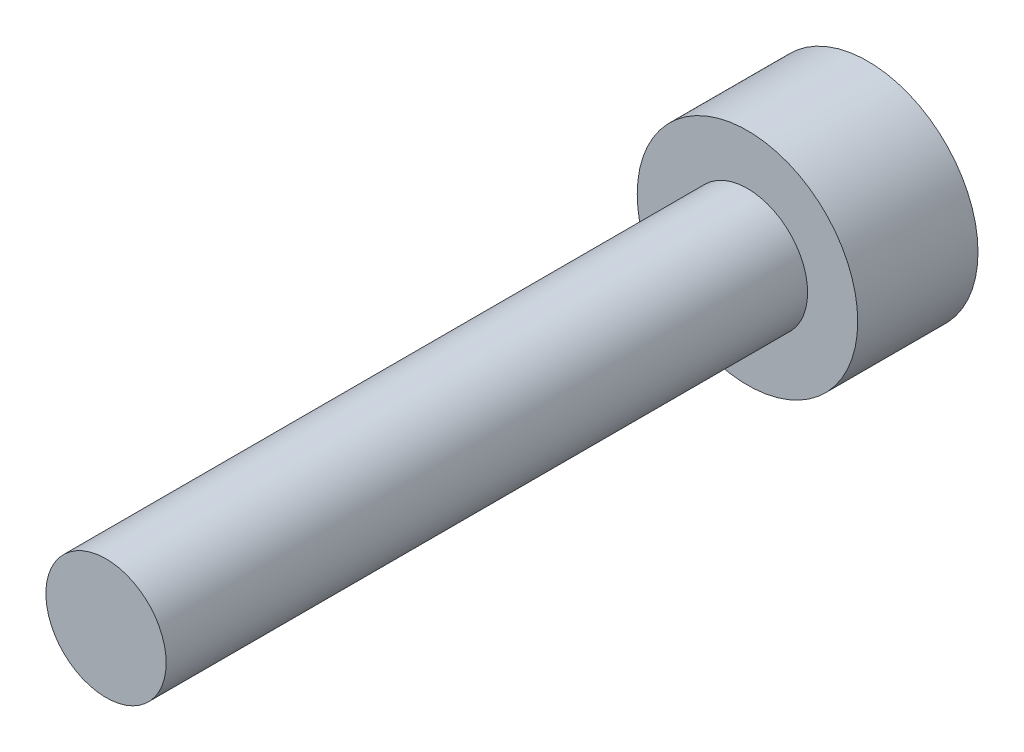
ISO-10303-21;
HEADER;
FILE_DESCRIPTION(('STEP AP214'),'2;1');
FILE_NAME('part.step','',(''),(''),'','','');
FILE_SCHEMA(('AUTOMOTIVE_DESIGN { 1 0 10303 214 1 1 1 1 }'));
ENDSEC;
DATA;
#1=APPLICATION_CONTEXT('core data for automotive mechanical design processes');
#2=APPLICATION_PROTOCOL_DEFINITION('international standard','automotive_design',2000,#1);
#3=PRODUCT_CONTEXT('',#1,'mechanical');
#4=PRODUCT('Part','Part','',(#3));
#5=PRODUCT_RELATED_PRODUCT_CATEGORY('part','',(#4));
#6=PRODUCT_DEFINITION_FORMATION('','',#4);
#7=PRODUCT_DEFINITION_CONTEXT('part definition',#1,'design');
#8=PRODUCT_DEFINITION('design','',#6,#7);
#9=PRODUCT_DEFINITION_SHAPE('','',#8);
#10=(LENGTH_UNIT() NAMED_UNIT(*) SI_UNIT(.MILLI.,.METRE.));
#11=(NAMED_UNIT(*) PLANE_ANGLE_UNIT() SI_UNIT($,.RADIAN.));
#12=(NAMED_UNIT(*) SI_UNIT($,.STERADIAN.) SOLID_ANGLE_UNIT());
#13=UNCERTAINTY_MEASURE_WITH_UNIT(LENGTH_MEASURE(1.E-05),#10,'distance_accuracy_value','');
#14=(GEOMETRIC_REPRESENTATION_CONTEXT(3) GLOBAL_UNCERTAINTY_ASSIGNED_CONTEXT((#13)) GLOBAL_UNIT_ASSIGNED_CONTEXT((#10,
#11,#12)) REPRESENTATION_CONTEXT('',''));
#15=CARTESIAN_POINT('',(0.,0.,0.));
#16=DIRECTION('',(0.,0.,1.));
#17=DIRECTION('',(1.,0.,0.));
#18=AXIS2_PLACEMENT_3D('',#15,#16,#17);
#19=CARTESIAN_POINT('',(0.,0.,-3.));
#20=DIRECTION('',(0.,0.,1.));
#21=DIRECTION('',(1.,0.,0.));
#22=AXIS2_PLACEMENT_3D('',#19,#20,#21);
#23=PLANE('',#22);
#24=CARTESIAN_POINT('',(0.,0.,-3.));
#25=DIRECTION('',(0.,0.,1.));
#26=DIRECTION('',(1.,0.,0.));
#27=AXIS2_PLACEMENT_3D('',#24,#25,#26);
#28=CIRCLE('',#27,2.75);
#29=CARTESIAN_POINT('',(2.75,0.,-3.));
#30=VERTEX_POINT('',#29);
#31=EDGE_CURVE('E50',#30,#30,#28,.T.);
#32=ORIENTED_EDGE('',*,*,#31,.F.);
#33=EDGE_LOOP('',(#32));
#34=FACE_BOUND('',#33,.T.);
#35=DIRECTION('',(0.866025403784441,-0.499999999999995,0.));
#36=VECTOR('',#35,1.);
#37=CARTESIAN_POINT('',(-1.24999999999999,-0.721687836487047,-3.));
#38=LINE('',#37,#36);
#39=CARTESIAN_POINT('',(-1.24999999999999,-0.721687836487047,-3.));
#40=VERTEX_POINT('',#39);
#41=CARTESIAN_POINT('',(0.,-1.44337567297406,-3.));
#42=VERTEX_POINT('',#41);
#43=EDGE_CURVE('E64',#40,#42,#38,.T.);
#44=ORIENTED_EDGE('',*,*,#43,.T.);
#45=DIRECTION('',(0.866025403784438,0.500000000000001,0.));
#46=VECTOR('',#45,1.);
#47=CARTESIAN_POINT('',(0.,-1.44337567297406,-3.));
#48=LINE('',#47,#46);
#49=CARTESIAN_POINT('',(1.25,-0.721687836487029,-3.));
#50=VERTEX_POINT('',#49);
#51=EDGE_CURVE('E140',#42,#50,#48,.T.);
#52=ORIENTED_EDGE('',*,*,#51,.T.);
#53=DIRECTION('',(0.,1.,0.));
#54=VECTOR('',#53,1.);
#55=CARTESIAN_POINT('',(1.25,-0.721687836487029,-3.));
#56=LINE('',#55,#54);
#57=CARTESIAN_POINT('',(1.25,0.721687836487038,-3.));
#58=VERTEX_POINT('',#57);
#59=EDGE_CURVE('E142',#50,#58,#56,.T.);
#60=ORIENTED_EDGE('',*,*,#59,.T.);
#61=DIRECTION('',(-0.866025403784442,0.499999999999995,0.));
#62=VECTOR('',#61,1.);
#63=CARTESIAN_POINT('',(1.25,0.721687836487038,-3.));
#64=LINE('',#63,#62);
#65=CARTESIAN_POINT('',(0.,1.44337567297406,-3.));
#66=VERTEX_POINT('',#65);
#67=EDGE_CURVE('E144',#58,#66,#64,.T.);
#68=ORIENTED_EDGE('',*,*,#67,.T.);
#69=DIRECTION('',(-0.866025403784434,-0.500000000000007,0.));
#70=VECTOR('',#69,1.);
#71=CARTESIAN_POINT('',(0.,1.44337567297406,-3.));
#72=LINE('',#71,#70);
#73=CARTESIAN_POINT('',(-1.25000000000001,0.721687836487021,-3.));
#74=VERTEX_POINT('',#73);
#75=EDGE_CURVE('E125',#66,#74,#72,.T.);
#76=ORIENTED_EDGE('',*,*,#75,.T.);
#77=DIRECTION('',(0.,-1.,0.));
#78=VECTOR('',#77,1.);
#79=CARTESIAN_POINT('',(-1.25000000000001,0.721687836487021,-3.));
#80=LINE('',#79,#78);
#81=EDGE_CURVE('E147',#74,#40,#80,.T.);
#82=ORIENTED_EDGE('',*,*,#81,.T.);
#83=EDGE_LOOP('',(#44,#52,#60,#68,#76,#82));
#84=FACE_BOUND('',#83,.T.);
#85=ADVANCED_FACE('F43',(#34,#84),#23,.F.);
#86=CARTESIAN_POINT('',(0.,0.,0.));
#87=DIRECTION('',(0.,0.,-1.));
#88=DIRECTION('',(-1.,0.,0.));
#89=AXIS2_PLACEMENT_3D('',#86,#87,#88);
#90=CYLINDRICAL_SURFACE('',#89,2.75);
#91=CARTESIAN_POINT('',(0.,0.,0.));
#92=DIRECTION('',(0.,0.,1.));
#93=DIRECTION('',(1.,0.,0.));
#94=AXIS2_PLACEMENT_3D('',#91,#92,#93);
#95=CIRCLE('',#94,2.75);
#96=CARTESIAN_POINT('',(2.75,0.,0.));
#97=VERTEX_POINT('',#96);
#98=EDGE_CURVE('E52',#97,#97,#95,.T.);
#99=ORIENTED_EDGE('',*,*,#98,.F.);
#100=EDGE_LOOP('',(#99));
#101=FACE_BOUND('',#100,.T.);
#102=ORIENTED_EDGE('',*,*,#31,.T.);
#103=EDGE_LOOP('',(#102));
#104=FACE_BOUND('',#103,.T.);
#105=ADVANCED_FACE('F44',(#101,#104),#90,.T.);
#106=CARTESIAN_POINT('',(0.,0.,0.));
#107=DIRECTION('',(0.,0.,1.));
#108=DIRECTION('',(1.,0.,0.));
#109=AXIS2_PLACEMENT_3D('',#106,#107,#108);
#110=PLANE('',#109);
#111=CARTESIAN_POINT('',(0.,0.,0.));
#112=DIRECTION('',(0.,0.,1.));
#113=DIRECTION('',(1.,0.,0.));
#114=AXIS2_PLACEMENT_3D('',#111,#112,#113);
#115=CIRCLE('',#114,1.5);
#116=CARTESIAN_POINT('',(1.5,0.,0.));
#117=VERTEX_POINT('',#116);
#118=EDGE_CURVE('E11',#117,#117,#115,.T.);
#119=ORIENTED_EDGE('',*,*,#118,.F.);
#120=EDGE_LOOP('',(#119));
#121=FACE_BOUND('',#120,.T.);
#122=ORIENTED_EDGE('',*,*,#98,.T.);
#123=EDGE_LOOP('',(#122));
#124=FACE_BOUND('',#123,.T.);
#125=ADVANCED_FACE('F211',(#121,#124),#110,.T.);
#126=CARTESIAN_POINT('',(0.,0.,16.));
#127=DIRECTION('',(0.,0.,-1.));
#128=DIRECTION('',(-1.,0.,0.));
#129=AXIS2_PLACEMENT_3D('',#126,#127,#128);
#130=CYLINDRICAL_SURFACE('',#129,1.5);
#131=CARTESIAN_POINT('',(0.,0.,16.));
#132=DIRECTION('',(0.,0.,1.));
#133=DIRECTION('',(1.,0.,0.));
#134=AXIS2_PLACEMENT_3D('',#131,#132,#133);
#135=CIRCLE('',#134,1.5);
#136=CARTESIAN_POINT('',(1.5,0.,16.));
#137=VERTEX_POINT('',#136);
#138=EDGE_CURVE('E170',#137,#137,#135,.T.);
#139=ORIENTED_EDGE('',*,*,#138,.F.);
#140=EDGE_LOOP('',(#139));
#141=FACE_BOUND('',#140,.T.);
#142=ORIENTED_EDGE('',*,*,#118,.T.);
#143=EDGE_LOOP('',(#142));
#144=FACE_BOUND('',#143,.T.);
#145=ADVANCED_FACE('F210',(#141,#144),#130,.T.);
#146=CARTESIAN_POINT('',(0.,0.,16.));
#147=DIRECTION('',(0.,0.,1.));
#148=DIRECTION('',(1.,0.,0.));
#149=AXIS2_PLACEMENT_3D('',#146,#147,#148);
#150=PLANE('',#149);
#151=ORIENTED_EDGE('',*,*,#138,.T.);
#152=EDGE_LOOP('',(#151));
#153=FACE_BOUND('',#152,.T.);
#154=ADVANCED_FACE('F203',(#153),#150,.T.);
#155=CARTESIAN_POINT('',(-1.24999999999999,-0.721687836487047,-1.5));
#156=DIRECTION('',(0.499999999999995,0.866025403784441,0.));
#157=DIRECTION('',(-0.866025403784442,0.499999999999995,0.));
#158=AXIS2_PLACEMENT_3D('',#155,#156,#157);
#159=PLANE('',#158);
#160=ORIENTED_EDGE('',*,*,#43,.F.);
#161=DIRECTION('',(0.,0.,-1.));
#162=VECTOR('',#161,1.);
#163=CARTESIAN_POINT('',(-1.24999999999999,-0.721687836487047,-1.5));
#164=LINE('',#163,#162);
#165=CARTESIAN_POINT('',(-1.24999999999999,-0.721687836487047,-1.5));
#166=VERTEX_POINT('',#165);
#167=EDGE_CURVE('E135',#166,#40,#164,.T.);
#168=ORIENTED_EDGE('',*,*,#167,.F.);
#169=DIRECTION('',(0.866025403784441,-0.499999999999995,0.));
#170=VECTOR('',#169,1.);
#171=CARTESIAN_POINT('',(-1.24999999999999,-0.721687836487047,-1.5));
#172=LINE('',#171,#170);
#173=CARTESIAN_POINT('',(0.,-1.44337567297406,-1.5));
#174=VERTEX_POINT('',#173);
#175=EDGE_CURVE('E152',#166,#174,#172,.T.);
#176=ORIENTED_EDGE('',*,*,#175,.T.);
#177=DIRECTION('',(0.,0.,-1.));
#178=VECTOR('',#177,1.);
#179=CARTESIAN_POINT('',(0.,-1.44337567297406,-1.5));
#180=LINE('',#179,#178);
#181=EDGE_CURVE('E163',#174,#42,#180,.T.);
#182=ORIENTED_EDGE('',*,*,#181,.T.);
#183=EDGE_LOOP('',(#160,#168,#176,#182));
#184=FACE_BOUND('',#183,.T.);
#185=ADVANCED_FACE('F184',(#184),#159,.T.);
#186=CARTESIAN_POINT('',(0.,-1.44337567297406,-1.5));
#187=DIRECTION('',(-0.500000000000001,0.866025403784438,0.));
#188=DIRECTION('',(-0.866025403784438,-0.500000000000001,0.));
#189=AXIS2_PLACEMENT_3D('',#186,#187,#188);
#190=PLANE('',#189);
#191=ORIENTED_EDGE('',*,*,#51,.F.);
#192=ORIENTED_EDGE('',*,*,#181,.F.);
#193=DIRECTION('',(0.866025403784438,0.500000000000001,0.));
#194=VECTOR('',#193,1.);
#195=CARTESIAN_POINT('',(0.,-1.44337567297406,-1.5));
#196=LINE('',#195,#194);
#197=CARTESIAN_POINT('',(1.25,-0.721687836487029,-1.5));
#198=VERTEX_POINT('',#197);
#199=EDGE_CURVE('E99',#174,#198,#196,.T.);
#200=ORIENTED_EDGE('',*,*,#199,.T.);
#201=DIRECTION('',(0.,0.,-1.));
#202=VECTOR('',#201,1.);
#203=CARTESIAN_POINT('',(1.25,-0.721687836487029,-1.5));
#204=LINE('',#203,#202);
#205=EDGE_CURVE('E161',#198,#50,#204,.T.);
#206=ORIENTED_EDGE('',*,*,#205,.T.);
#207=EDGE_LOOP('',(#191,#192,#200,#206));
#208=FACE_BOUND('',#207,.T.);
#209=ADVANCED_FACE('F191',(#208),#190,.T.);
#210=CARTESIAN_POINT('',(1.25,-0.721687836487029,-1.5));
#211=DIRECTION('',(-1.,0.,0.));
#212=DIRECTION('',(0.,-1.,0.));
#213=AXIS2_PLACEMENT_3D('',#210,#211,#212);
#214=PLANE('',#213);
#215=ORIENTED_EDGE('',*,*,#59,.F.);
#216=ORIENTED_EDGE('',*,*,#205,.F.);
#217=DIRECTION('',(0.,1.,0.));
#218=VECTOR('',#217,1.);
#219=CARTESIAN_POINT('',(1.25,-0.721687836487029,-1.5));
#220=LINE('',#219,#218);
#221=CARTESIAN_POINT('',(1.25,0.721687836487038,-1.5));
#222=VERTEX_POINT('',#221);
#223=EDGE_CURVE('E118',#198,#222,#220,.T.);
#224=ORIENTED_EDGE('',*,*,#223,.T.);
#225=DIRECTION('',(0.,0.,-1.));
#226=VECTOR('',#225,1.);
#227=CARTESIAN_POINT('',(1.25,0.721687836487038,-1.5));
#228=LINE('',#227,#226);
#229=EDGE_CURVE('E113',#222,#58,#228,.T.);
#230=ORIENTED_EDGE('',*,*,#229,.T.);
#231=EDGE_LOOP('',(#215,#216,#224,#230));
#232=FACE_BOUND('',#231,.T.);
#233=ADVANCED_FACE('F194',(#232),#214,.T.);
#234=CARTESIAN_POINT('',(1.25,0.721687836487038,-1.5));
#235=DIRECTION('',(-0.499999999999995,-0.866025403784441,0.));
#236=DIRECTION('',(0.866025403784442,-0.499999999999995,0.));
#237=AXIS2_PLACEMENT_3D('',#234,#235,#236);
#238=PLANE('',#237);
#239=ORIENTED_EDGE('',*,*,#67,.F.);
#240=ORIENTED_EDGE('',*,*,#229,.F.);
#241=DIRECTION('',(-0.866025403784442,0.499999999999995,0.));
#242=VECTOR('',#241,1.);
#243=CARTESIAN_POINT('',(1.25,0.721687836487038,-1.5));
#244=LINE('',#243,#242);
#245=CARTESIAN_POINT('',(0.,1.44337567297406,-1.5));
#246=VERTEX_POINT('',#245);
#247=EDGE_CURVE('E109',#222,#246,#244,.T.);
#248=ORIENTED_EDGE('',*,*,#247,.T.);
#249=DIRECTION('',(0.,0.,-1.));
#250=VECTOR('',#249,1.);
#251=CARTESIAN_POINT('',(0.,1.44337567297406,-1.5));
#252=LINE('',#251,#250);
#253=EDGE_CURVE('E111',#246,#66,#252,.T.);
#254=ORIENTED_EDGE('',*,*,#253,.T.);
#255=EDGE_LOOP('',(#239,#240,#248,#254));
#256=FACE_BOUND('',#255,.T.);
#257=ADVANCED_FACE('F114',(#256),#238,.T.);
#258=CARTESIAN_POINT('',(0.,1.44337567297406,-1.5));
#259=DIRECTION('',(0.500000000000007,-0.866025403784435,0.));
#260=DIRECTION('',(0.866025403784434,0.500000000000007,0.));
#261=AXIS2_PLACEMENT_3D('',#258,#259,#260);
#262=PLANE('',#261);
#263=ORIENTED_EDGE('',*,*,#75,.F.);
#264=ORIENTED_EDGE('',*,*,#253,.F.);
#265=DIRECTION('',(-0.866025403784434,-0.500000000000007,0.));
#266=VECTOR('',#265,1.);
#267=CARTESIAN_POINT('',(0.,1.44337567297406,-1.5));
#268=LINE('',#267,#266);
#269=CARTESIAN_POINT('',(-1.25000000000001,0.721687836487021,-1.5));
#270=VERTEX_POINT('',#269);
#271=EDGE_CURVE('E120',#246,#270,#268,.T.);
#272=ORIENTED_EDGE('',*,*,#271,.T.);
#273=DIRECTION('',(0.,0.,-1.));
#274=VECTOR('',#273,1.);
#275=CARTESIAN_POINT('',(-1.25000000000001,0.721687836487021,-1.5));
#276=LINE('',#275,#274);
#277=EDGE_CURVE('E93',#270,#74,#276,.T.);
#278=ORIENTED_EDGE('',*,*,#277,.T.);
#279=EDGE_LOOP('',(#263,#264,#272,#278));
#280=FACE_BOUND('',#279,.T.);
#281=ADVANCED_FACE('F122',(#280),#262,.T.);
#282=CARTESIAN_POINT('',(-1.25000000000001,0.721687836487021,-1.5));
#283=DIRECTION('',(1.,0.,0.));
#284=DIRECTION('',(0.,1.,0.));
#285=AXIS2_PLACEMENT_3D('',#282,#283,#284);
#286=PLANE('',#285);
#287=ORIENTED_EDGE('',*,*,#81,.F.);
#288=ORIENTED_EDGE('',*,*,#277,.F.);
#289=DIRECTION('',(0.,-1.,0.));
#290=VECTOR('',#289,1.);
#291=CARTESIAN_POINT('',(-1.25000000000001,0.721687836487021,-1.5));
#292=LINE('',#291,#290);
#293=EDGE_CURVE('E66',#270,#166,#292,.T.);
#294=ORIENTED_EDGE('',*,*,#293,.T.);
#295=ORIENTED_EDGE('',*,*,#167,.T.);
#296=EDGE_LOOP('',(#287,#288,#294,#295));
#297=FACE_BOUND('',#296,.T.);
#298=ADVANCED_FACE('F181',(#297),#286,.T.);
#299=CARTESIAN_POINT('',(0.,0.,-1.5));
#300=DIRECTION('',(0.,0.,1.));
#301=DIRECTION('',(1.,0.,0.));
#302=AXIS2_PLACEMENT_3D('',#299,#300,#301);
#303=PLANE('',#302);
#304=ORIENTED_EDGE('',*,*,#175,.F.);
#305=ORIENTED_EDGE('',*,*,#293,.F.);
#306=ORIENTED_EDGE('',*,*,#271,.F.);
#307=ORIENTED_EDGE('',*,*,#247,.F.);
#308=ORIENTED_EDGE('',*,*,#223,.F.);
#309=ORIENTED_EDGE('',*,*,#199,.F.);
#310=EDGE_LOOP('',(#304,#305,#306,#307,#308,#309));
#311=FACE_BOUND('',#310,.T.);
#312=ADVANCED_FACE('F130',(#311),#303,.F.);
#313=CLOSED_SHELL('',(#85,#105,#125,#145,#154,#185,#209,#233,#257,#281,#298,#312));
#314=MANIFOLD_SOLID_BREP('B2',#313);
#315=ADVANCED_BREP_SHAPE_REPRESENTATION('',(#18,#314),#14);
#316=SHAPE_DEFINITION_REPRESENTATION(#9,#315);
ENDSEC;
END-ISO-10303-21;
